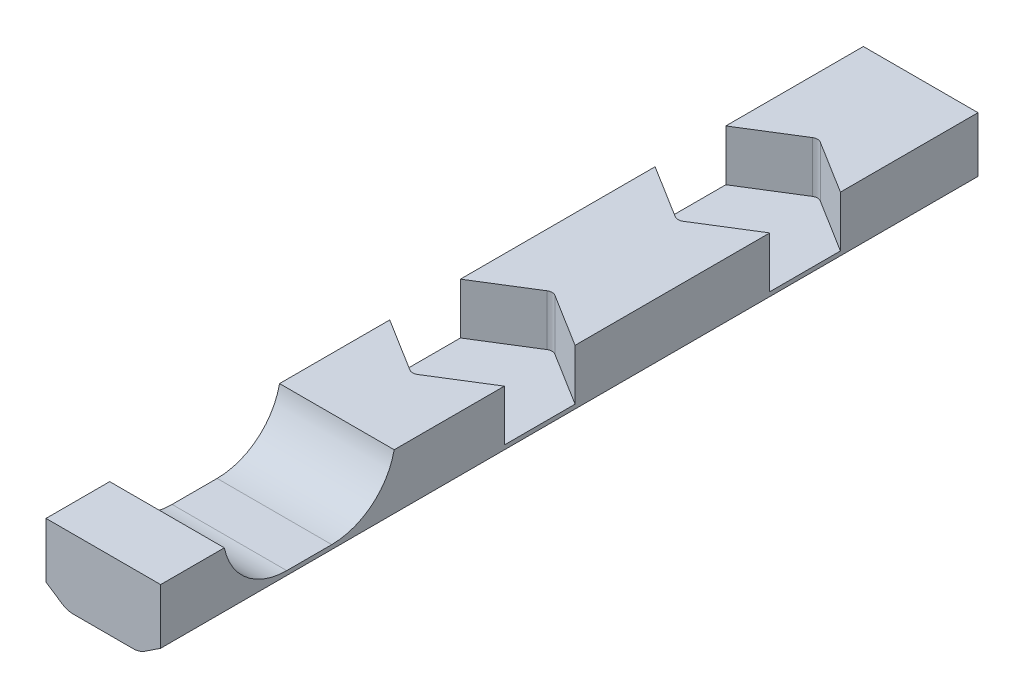
ISO-10303-21;
HEADER;
FILE_DESCRIPTION(('STEP AP214'),'2;1');
FILE_NAME('part.step','',(''),(''),'','','');
FILE_SCHEMA(('AUTOMOTIVE_DESIGN { 1 0 10303 214 1 1 1 1 }'));
ENDSEC;
DATA;
#1=APPLICATION_CONTEXT('core data for automotive mechanical design processes');
#2=APPLICATION_PROTOCOL_DEFINITION('international standard','automotive_design',2000,#1);
#3=PRODUCT_CONTEXT('',#1,'mechanical');
#4=PRODUCT('Part','Part','',(#3));
#5=PRODUCT_RELATED_PRODUCT_CATEGORY('part','',(#4));
#6=PRODUCT_DEFINITION_FORMATION('','',#4);
#7=PRODUCT_DEFINITION_CONTEXT('part definition',#1,'design');
#8=PRODUCT_DEFINITION('design','',#6,#7);
#9=PRODUCT_DEFINITION_SHAPE('','',#8);
#10=(LENGTH_UNIT() NAMED_UNIT(*) SI_UNIT(.MILLI.,.METRE.));
#11=(NAMED_UNIT(*) PLANE_ANGLE_UNIT() SI_UNIT($,.RADIAN.));
#12=(NAMED_UNIT(*) SI_UNIT($,.STERADIAN.) SOLID_ANGLE_UNIT());
#13=UNCERTAINTY_MEASURE_WITH_UNIT(LENGTH_MEASURE(1.E-05),#10,'distance_accuracy_value','');
#14=(GEOMETRIC_REPRESENTATION_CONTEXT(3) GLOBAL_UNCERTAINTY_ASSIGNED_CONTEXT((#13)) GLOBAL_UNIT_ASSIGNED_CONTEXT((#10,
#11,#12)) REPRESENTATION_CONTEXT('',''));
#15=CARTESIAN_POINT('',(0.,0.,0.));
#16=DIRECTION('',(0.,0.,1.));
#17=DIRECTION('',(1.,0.,0.));
#18=AXIS2_PLACEMENT_3D('',#15,#16,#17);
#19=CARTESIAN_POINT('',(4.4,3.26332495807108,38.5));
#20=DIRECTION('',(0.,-1.,0.));
#21=DIRECTION('',(1.,0.,0.));
#22=AXIS2_PLACEMENT_3D('',#19,#20,#21);
#23=PLANE('',#22);
#24=DIRECTION('',(0.,0.,-1.));
#25=VECTOR('',#24,1.);
#26=CARTESIAN_POINT('',(-1.,3.26332495807108,38.5));
#27=LINE('',#26,#25);
#28=CARTESIAN_POINT('',(-1.,3.26332495807108,27.5));
#29=VERTEX_POINT('',#28);
#30=CARTESIAN_POINT('',(-1.,3.26332495807108,22.31));
#31=VERTEX_POINT('',#30);
#32=EDGE_CURVE('E238',#29,#31,#27,.T.);
#33=ORIENTED_EDGE('',*,*,#32,.F.);
#34=DIRECTION('',(-1.,0.,0.));
#35=VECTOR('',#34,1.);
#36=CARTESIAN_POINT('',(-1.,3.26332495807108,27.5));
#37=LINE('',#36,#35);
#38=CARTESIAN_POINT('',(4.4,3.26332495807108,27.5));
#39=VERTEX_POINT('',#38);
#40=EDGE_CURVE('E228',#39,#29,#37,.T.);
#41=ORIENTED_EDGE('',*,*,#40,.F.);
#42=DIRECTION('',(0.,0.,-1.));
#43=VECTOR('',#42,1.);
#44=CARTESIAN_POINT('',(4.4,3.26332495807108,38.5));
#45=LINE('',#44,#43);
#46=CARTESIAN_POINT('',(4.4,3.26332495807108,22.31));
#47=VERTEX_POINT('',#46);
#48=EDGE_CURVE('E370',#39,#47,#45,.T.);
#49=ORIENTED_EDGE('',*,*,#48,.T.);
#50=DIRECTION('',(0.849056603773585,0.,-0.528301886792453));
#51=VECTOR('',#50,1.);
#52=CARTESIAN_POINT('',(1.7,3.26332495807108,23.99));
#53=LINE('',#52,#51);
#54=CARTESIAN_POINT('',(1.88490566037736,3.26332495807108,23.8749475890985));
#55=VERTEX_POINT('',#54);
#56=EDGE_CURVE('E412',#55,#47,#53,.T.);
#57=ORIENTED_EDGE('',*,*,#56,.F.);
#58=CARTESIAN_POINT('',(1.7,3.26332495807108,23.5777777777778));
#59=DIRECTION('',(0.,-1.,0.));
#60=DIRECTION('',(1.,0.,0.));
#61=AXIS2_PLACEMENT_3D('',#58,#59,#60);
#62=CIRCLE('',#61,0.35);
#63=CARTESIAN_POINT('',(1.51509433962264,3.26332495807108,23.8749475890985));
#64=VERTEX_POINT('',#63);
#65=EDGE_CURVE('E280',#55,#64,#62,.T.);
#66=ORIENTED_EDGE('',*,*,#65,.T.);
#67=DIRECTION('',(0.849056603773585,0.,0.528301886792453));
#68=VECTOR('',#67,1.);
#69=CARTESIAN_POINT('',(-1.,3.26332495807108,22.31));
#70=LINE('',#69,#68);
#71=EDGE_CURVE('E422',#31,#64,#70,.T.);
#72=ORIENTED_EDGE('',*,*,#71,.F.);
#73=EDGE_LOOP('',(#33,#41,#49,#57,#66,#72));
#74=FACE_BOUND('',#73,.T.);
#75=ADVANCED_FACE('F33',(#74),#23,.F.);
#76=CARTESIAN_POINT('',(4.4,3.26332495807108,38.5));
#77=VERTEX_POINT('',#76);
#78=CARTESIAN_POINT('',(4.4,3.26332495807108,35.5));
#79=VERTEX_POINT('',#78);
#80=EDGE_CURVE('E225',#77,#79,#45,.T.);
#81=ORIENTED_EDGE('',*,*,#80,.T.);
#82=DIRECTION('',(1.,0.,0.));
#83=VECTOR('',#82,1.);
#84=CARTESIAN_POINT('',(-1.,3.26332495807108,35.5));
#85=LINE('',#84,#83);
#86=CARTESIAN_POINT('',(-1.,3.26332495807108,35.5));
#87=VERTEX_POINT('',#86);
#88=EDGE_CURVE('E218',#87,#79,#85,.T.);
#89=ORIENTED_EDGE('',*,*,#88,.F.);
#90=CARTESIAN_POINT('',(-1.,3.26332495807108,38.5));
#91=VERTEX_POINT('',#90);
#92=EDGE_CURVE('E222',#91,#87,#27,.T.);
#93=ORIENTED_EDGE('',*,*,#92,.F.);
#94=DIRECTION('',(-1.,0.,0.));
#95=VECTOR('',#94,1.);
#96=CARTESIAN_POINT('',(4.4,3.26332495807108,38.5));
#97=LINE('',#96,#95);
#98=EDGE_CURVE('E349',#77,#91,#97,.T.);
#99=ORIENTED_EDGE('',*,*,#98,.F.);
#100=EDGE_LOOP('',(#81,#89,#93,#99));
#101=FACE_BOUND('',#100,.T.);
#102=ADVANCED_FACE('F220',(#101),#23,.F.);
#103=CARTESIAN_POINT('',(-1.,3.26332495807108,18.98));
#104=VERTEX_POINT('',#103);
#105=CARTESIAN_POINT('',(-1.,3.26332495807108,9.81));
#106=VERTEX_POINT('',#105);
#107=EDGE_CURVE('E423',#104,#106,#27,.T.);
#108=ORIENTED_EDGE('',*,*,#107,.F.);
#109=DIRECTION('',(-0.849056603773585,0.,0.528301886792453));
#110=VECTOR('',#109,1.);
#111=CARTESIAN_POINT('',(1.7,3.26332495807108,17.3));
#112=LINE('',#111,#110);
#113=CARTESIAN_POINT('',(1.51509433962264,3.26332495807108,17.4150524109015));
#114=VERTEX_POINT('',#113);
#115=EDGE_CURVE('E732',#114,#104,#112,.T.);
#116=ORIENTED_EDGE('',*,*,#115,.F.);
#117=CARTESIAN_POINT('',(1.7,3.26332495807108,17.7122222222222));
#118=DIRECTION('',(0.,-1.,0.));
#119=DIRECTION('',(1.,0.,0.));
#120=AXIS2_PLACEMENT_3D('',#117,#118,#119);
#121=CIRCLE('',#120,0.35);
#122=CARTESIAN_POINT('',(1.88490566037735,3.26332495807108,17.4150524109015));
#123=VERTEX_POINT('',#122);
#124=EDGE_CURVE('E278',#114,#123,#121,.T.);
#125=ORIENTED_EDGE('',*,*,#124,.T.);
#126=DIRECTION('',(-0.849056603773585,0.,-0.528301886792453));
#127=VECTOR('',#126,1.);
#128=CARTESIAN_POINT('',(4.4,3.26332495807108,18.98));
#129=LINE('',#128,#127);
#130=CARTESIAN_POINT('',(4.4,3.26332495807108,18.98));
#131=VERTEX_POINT('',#130);
#132=EDGE_CURVE('E734',#131,#123,#129,.T.);
#133=ORIENTED_EDGE('',*,*,#132,.F.);
#134=CARTESIAN_POINT('',(4.4,3.26332495807108,9.81));
#135=VERTEX_POINT('',#134);
#136=EDGE_CURVE('E459',#131,#135,#45,.T.);
#137=ORIENTED_EDGE('',*,*,#136,.T.);
#138=DIRECTION('',(0.849056603773585,0.,-0.528301886792453));
#139=VECTOR('',#138,1.);
#140=CARTESIAN_POINT('',(1.7,3.26332495807108,11.49));
#141=LINE('',#140,#139);
#142=CARTESIAN_POINT('',(1.88490566037736,3.26332495807108,11.3749475890985));
#143=VERTEX_POINT('',#142);
#144=EDGE_CURVE('E298',#143,#135,#141,.T.);
#145=ORIENTED_EDGE('',*,*,#144,.F.);
#146=CARTESIAN_POINT('',(1.7,3.26332495807108,11.0777777777778));
#147=DIRECTION('',(0.,-1.,0.));
#148=DIRECTION('',(1.,0.,0.));
#149=AXIS2_PLACEMENT_3D('',#146,#147,#148);
#150=CIRCLE('',#149,0.35);
#151=CARTESIAN_POINT('',(1.51509433962264,3.26332495807108,11.3749475890985));
#152=VERTEX_POINT('',#151);
#153=EDGE_CURVE('E11',#143,#152,#150,.T.);
#154=ORIENTED_EDGE('',*,*,#153,.T.);
#155=DIRECTION('',(0.849056603773585,0.,0.528301886792453));
#156=VECTOR('',#155,1.);
#157=CARTESIAN_POINT('',(-1.,3.26332495807108,9.81));
#158=LINE('',#157,#156);
#159=EDGE_CURVE('E328',#106,#152,#158,.T.);
#160=ORIENTED_EDGE('',*,*,#159,.F.);
#161=EDGE_LOOP('',(#108,#116,#125,#133,#137,#145,#154,#160));
#162=FACE_BOUND('',#161,.T.);
#163=ADVANCED_FACE('F486',(#162),#23,.F.);
#164=CARTESIAN_POINT('',(-1.,0.663324958071079,38.5));
#165=DIRECTION('',(0.552770798392566,0.833333333333334,0.));
#166=DIRECTION('',(-0.833333333333334,0.552770798392566,0.));
#167=AXIS2_PLACEMENT_3D('',#164,#165,#166);
#168=PLANE('',#167);
#169=DIRECTION('',(0.833333333333334,-0.552770798392566,0.));
#170=VECTOR('',#169,1.);
#171=CARTESIAN_POINT('',(-1.,0.663324958071079,0.));
#172=LINE('',#171,#170);
#173=CARTESIAN_POINT('',(-1.,0.663324958071079,0.));
#174=VERTEX_POINT('',#173);
#175=CARTESIAN_POINT('',(-0.251259453814803,0.166666666666667,0.));
#176=VERTEX_POINT('',#175);
#177=EDGE_CURVE('E334',#174,#176,#172,.T.);
#178=ORIENTED_EDGE('',*,*,#177,.T.);
#179=DIRECTION('',(0.,0.,-1.));
#180=VECTOR('',#179,1.);
#181=CARTESIAN_POINT('',(-0.251259453814803,0.166666666666667,38.5));
#182=LINE('',#181,#180);
#183=CARTESIAN_POINT('',(-0.251259453814803,0.166666666666667,38.5));
#184=VERTEX_POINT('',#183);
#185=EDGE_CURVE('E389',#176,#184,#182,.F.);
#186=ORIENTED_EDGE('',*,*,#185,.T.);
#187=DIRECTION('',(0.833333333333334,-0.552770798392566,0.));
#188=VECTOR('',#187,1.);
#189=CARTESIAN_POINT('',(-1.,0.663324958071079,38.5));
#190=LINE('',#189,#188);
#191=CARTESIAN_POINT('',(-1.,0.663324958071079,38.5));
#192=VERTEX_POINT('',#191);
#193=EDGE_CURVE('E339',#192,#184,#190,.T.);
#194=ORIENTED_EDGE('',*,*,#193,.F.);
#195=DIRECTION('',(0.,0.,-1.));
#196=VECTOR('',#195,1.);
#197=CARTESIAN_POINT('',(-1.,0.663324958071079,38.5));
#198=LINE('',#197,#196);
#199=EDGE_CURVE('E352',#192,#174,#198,.T.);
#200=ORIENTED_EDGE('',*,*,#199,.T.);
#201=EDGE_LOOP('',(#178,#186,#194,#200));
#202=FACE_BOUND('',#201,.T.);
#203=ADVANCED_FACE('F436',(#202),#168,.F.);
#204=CARTESIAN_POINT('',(0.,0.,38.5));
#205=DIRECTION('',(0.,1.,0.));
#206=DIRECTION('',(0.,0.,1.));
#207=AXIS2_PLACEMENT_3D('',#204,#205,#206);
#208=PLANE('',#207);
#209=DIRECTION('',(1.,0.,0.));
#210=VECTOR('',#209,1.);
#211=CARTESIAN_POINT('',(0.,0.,38.5));
#212=LINE('',#211,#210);
#213=CARTESIAN_POINT('',(0.301511344577763,0.,38.5));
#214=VERTEX_POINT('',#213);
#215=CARTESIAN_POINT('',(3.09848865542224,0.,38.5));
#216=VERTEX_POINT('',#215);
#217=EDGE_CURVE('E342',#214,#216,#212,.T.);
#218=ORIENTED_EDGE('',*,*,#217,.F.);
#219=DIRECTION('',(0.,0.,-1.));
#220=VECTOR('',#219,1.);
#221=CARTESIAN_POINT('',(0.301511344577763,0.,38.5));
#222=LINE('',#221,#220);
#223=CARTESIAN_POINT('',(0.301511344577763,0.,0.));
#224=VERTEX_POINT('',#223);
#225=EDGE_CURVE('E384',#214,#224,#222,.T.);
#226=ORIENTED_EDGE('',*,*,#225,.T.);
#227=DIRECTION('',(1.,0.,0.));
#228=VECTOR('',#227,1.);
#229=CARTESIAN_POINT('',(0.,0.,0.));
#230=LINE('',#229,#228);
#231=CARTESIAN_POINT('',(3.09848865542224,0.,0.));
#232=VERTEX_POINT('',#231);
#233=EDGE_CURVE('E355',#224,#232,#230,.T.);
#234=ORIENTED_EDGE('',*,*,#233,.T.);
#235=DIRECTION('',(0.,0.,-1.));
#236=VECTOR('',#235,1.);
#237=CARTESIAN_POINT('',(3.09848865542224,0.,38.5));
#238=LINE('',#237,#236);
#239=EDGE_CURVE('E379',#232,#216,#238,.F.);
#240=ORIENTED_EDGE('',*,*,#239,.T.);
#241=EDGE_LOOP('',(#218,#226,#234,#240));
#242=FACE_BOUND('',#241,.T.);
#243=ADVANCED_FACE('F446',(#242),#208,.F.);
#244=CARTESIAN_POINT('',(3.4,0.,38.5));
#245=DIRECTION('',(-0.552770798392566,0.833333333333333,0.));
#246=DIRECTION('',(-0.833333333333333,-0.552770798392566,0.));
#247=AXIS2_PLACEMENT_3D('',#244,#245,#246);
#248=PLANE('',#247);
#249=DIRECTION('',(0.833333333333333,0.552770798392566,0.));
#250=VECTOR('',#249,1.);
#251=CARTESIAN_POINT('',(3.4,0.,38.5));
#252=LINE('',#251,#250);
#253=CARTESIAN_POINT('',(3.6512594538148,0.166666666666666,38.5));
#254=VERTEX_POINT('',#253);
#255=CARTESIAN_POINT('',(4.4,0.66332495807108,38.5));
#256=VERTEX_POINT('',#255);
#257=EDGE_CURVE('E345',#254,#256,#252,.T.);
#258=ORIENTED_EDGE('',*,*,#257,.F.);
#259=DIRECTION('',(0.,0.,-1.));
#260=VECTOR('',#259,1.);
#261=CARTESIAN_POINT('',(3.6512594538148,0.166666666666666,38.5));
#262=LINE('',#261,#260);
#263=CARTESIAN_POINT('',(3.6512594538148,0.166666666666666,0.));
#264=VERTEX_POINT('',#263);
#265=EDGE_CURVE('E373',#254,#264,#262,.T.);
#266=ORIENTED_EDGE('',*,*,#265,.T.);
#267=DIRECTION('',(0.833333333333333,0.552770798392566,0.));
#268=VECTOR('',#267,1.);
#269=CARTESIAN_POINT('',(3.4,0.,0.));
#270=LINE('',#269,#268);
#271=CARTESIAN_POINT('',(4.4,0.66332495807108,0.));
#272=VERTEX_POINT('',#271);
#273=EDGE_CURVE('E357',#264,#272,#270,.T.);
#274=ORIENTED_EDGE('',*,*,#273,.T.);
#275=DIRECTION('',(0.,0.,-1.));
#276=VECTOR('',#275,1.);
#277=CARTESIAN_POINT('',(4.4,0.66332495807108,38.5));
#278=LINE('',#277,#276);
#279=EDGE_CURVE('E369',#256,#272,#278,.T.);
#280=ORIENTED_EDGE('',*,*,#279,.F.);
#281=EDGE_LOOP('',(#258,#266,#274,#280));
#282=FACE_BOUND('',#281,.T.);
#283=ADVANCED_FACE('F455',(#282),#248,.F.);
#284=CARTESIAN_POINT('',(4.4,0.66332495807108,38.5));
#285=DIRECTION('',(-1.,0.,0.));
#286=DIRECTION('',(0.,0.,1.));
#287=AXIS2_PLACEMENT_3D('',#284,#285,#286);
#288=PLANE('',#287);
#289=ORIENTED_EDGE('',*,*,#48,.F.);
#290=CARTESIAN_POINT('',(4.4,3.86332495807108,30.4393876913398));
#291=DIRECTION('',(-1.,0.,0.));
#292=DIRECTION('',(0.,0.,1.));
#293=AXIS2_PLACEMENT_3D('',#290,#291,#292);
#294=CIRCLE('',#293,3.);
#295=CARTESIAN_POINT('',(4.4,0.86332495807108,30.4393876913398));
#296=VERTEX_POINT('',#295);
#297=EDGE_CURVE('E251',#39,#296,#294,.T.);
#298=ORIENTED_EDGE('',*,*,#297,.T.);
#299=DIRECTION('',(0.,0.,-1.));
#300=VECTOR('',#299,1.);
#301=CARTESIAN_POINT('',(4.4,0.86332495807108,35.5));
#302=LINE('',#301,#300);
#303=CARTESIAN_POINT('',(4.4,0.86332495807108,32.5606123086602));
#304=VERTEX_POINT('',#303);
#305=EDGE_CURVE('E404',#304,#296,#302,.T.);
#306=ORIENTED_EDGE('',*,*,#305,.F.);
#307=CARTESIAN_POINT('',(4.4,3.86332495807108,32.5606123086602));
#308=DIRECTION('',(-1.,0.,0.));
#309=DIRECTION('',(0.,0.,1.));
#310=AXIS2_PLACEMENT_3D('',#307,#308,#309);
#311=CIRCLE('',#310,3.);
#312=EDGE_CURVE('E246',#304,#79,#311,.T.);
#313=ORIENTED_EDGE('',*,*,#312,.T.);
#314=ORIENTED_EDGE('',*,*,#80,.F.);
#315=DIRECTION('',(0.,1.,0.));
#316=VECTOR('',#315,1.);
#317=CARTESIAN_POINT('',(4.4,0.66332495807108,38.5));
#318=LINE('',#317,#316);
#319=EDGE_CURVE('E347',#256,#77,#318,.T.);
#320=ORIENTED_EDGE('',*,*,#319,.F.);
#321=ORIENTED_EDGE('',*,*,#279,.T.);
#322=DIRECTION('',(0.,1.,0.));
#323=VECTOR('',#322,1.);
#324=CARTESIAN_POINT('',(4.4,0.66332495807108,0.));
#325=LINE('',#324,#323);
#326=CARTESIAN_POINT('',(4.4,3.26332495807108,0.));
#327=VERTEX_POINT('',#326);
#328=EDGE_CURVE('E359',#272,#327,#325,.T.);
#329=ORIENTED_EDGE('',*,*,#328,.T.);
#330=CARTESIAN_POINT('',(4.4,3.26332495807108,6.48));
#331=VERTEX_POINT('',#330);
#332=EDGE_CURVE('E237',#331,#327,#45,.T.);
#333=ORIENTED_EDGE('',*,*,#332,.F.);
#334=DIRECTION('',(0.,1.,0.));
#335=VECTOR('',#334,1.);
#336=CARTESIAN_POINT('',(4.4,0.86332495807108,6.48));
#337=LINE('',#336,#335);
#338=CARTESIAN_POINT('',(4.4,0.86332495807108,6.48));
#339=VERTEX_POINT('',#338);
#340=EDGE_CURVE('E297',#339,#331,#337,.T.);
#341=ORIENTED_EDGE('',*,*,#340,.F.);
#342=DIRECTION('',(0.,0.,-1.));
#343=VECTOR('',#342,1.);
#344=CARTESIAN_POINT('',(4.4,0.86332495807108,9.81));
#345=LINE('',#344,#343);
#346=CARTESIAN_POINT('',(4.4,0.86332495807108,9.81));
#347=VERTEX_POINT('',#346);
#348=EDGE_CURVE('E318',#347,#339,#345,.T.);
#349=ORIENTED_EDGE('',*,*,#348,.F.);
#350=DIRECTION('',(0.,1.,0.));
#351=VECTOR('',#350,1.);
#352=CARTESIAN_POINT('',(4.4,0.86332495807108,9.81));
#353=LINE('',#352,#351);
#354=EDGE_CURVE('E324',#347,#135,#353,.T.);
#355=ORIENTED_EDGE('',*,*,#354,.T.);
#356=ORIENTED_EDGE('',*,*,#136,.F.);
#357=DIRECTION('',(0.,1.,0.));
#358=VECTOR('',#357,1.);
#359=CARTESIAN_POINT('',(4.4,0.86332495807108,18.98));
#360=LINE('',#359,#358);
#361=CARTESIAN_POINT('',(4.4,0.86332495807108,18.98));
#362=VERTEX_POINT('',#361);
#363=EDGE_CURVE('E472',#362,#131,#360,.T.);
#364=ORIENTED_EDGE('',*,*,#363,.F.);
#365=DIRECTION('',(0.,0.,-1.));
#366=VECTOR('',#365,1.);
#367=CARTESIAN_POINT('',(4.4,0.86332495807108,22.31));
#368=LINE('',#367,#366);
#369=CARTESIAN_POINT('',(4.4,0.86332495807108,22.31));
#370=VERTEX_POINT('',#369);
#371=EDGE_CURVE('E469',#370,#362,#368,.T.);
#372=ORIENTED_EDGE('',*,*,#371,.F.);
#373=DIRECTION('',(0.,1.,0.));
#374=VECTOR('',#373,1.);
#375=CARTESIAN_POINT('',(4.4,0.86332495807108,22.31));
#376=LINE('',#375,#374);
#377=EDGE_CURVE('E466',#370,#47,#376,.T.);
#378=ORIENTED_EDGE('',*,*,#377,.T.);
#379=EDGE_LOOP('',(#289,#298,#306,#313,#314,#320,#321,#329,#333,#341,#349,#355,#356,#364,#372,#378));
#380=FACE_BOUND('',#379,.T.);
#381=ADVANCED_FACE('F403',(#380),#288,.F.);
#382=CARTESIAN_POINT('',(-1.,3.26332495807108,6.48));
#383=VERTEX_POINT('',#382);
#384=CARTESIAN_POINT('',(-1.,3.26332495807108,0.));
#385=VERTEX_POINT('',#384);
#386=EDGE_CURVE('E240',#383,#385,#27,.T.);
#387=ORIENTED_EDGE('',*,*,#386,.F.);
#388=DIRECTION('',(-0.849056603773585,0.,0.528301886792453));
#389=VECTOR('',#388,1.);
#390=CARTESIAN_POINT('',(1.7,3.26332495807108,4.8));
#391=LINE('',#390,#389);
#392=CARTESIAN_POINT('',(1.51509433962264,3.26332495807108,4.91505241090147));
#393=VERTEX_POINT('',#392);
#394=EDGE_CURVE('E289',#393,#383,#391,.T.);
#395=ORIENTED_EDGE('',*,*,#394,.F.);
#396=CARTESIAN_POINT('',(1.7,3.26332495807108,5.21222222222222));
#397=DIRECTION('',(0.,-1.,0.));
#398=DIRECTION('',(1.,0.,0.));
#399=AXIS2_PLACEMENT_3D('',#396,#397,#398);
#400=CIRCLE('',#399,0.35);
#401=CARTESIAN_POINT('',(1.88490566037736,3.26332495807108,4.91505241090147));
#402=VERTEX_POINT('',#401);
#403=EDGE_CURVE('E41',#393,#402,#400,.T.);
#404=ORIENTED_EDGE('',*,*,#403,.T.);
#405=DIRECTION('',(-0.849056603773585,0.,-0.528301886792453));
#406=VECTOR('',#405,1.);
#407=CARTESIAN_POINT('',(4.4,3.26332495807108,6.48));
#408=LINE('',#407,#406);
#409=EDGE_CURVE('E287',#331,#402,#408,.T.);
#410=ORIENTED_EDGE('',*,*,#409,.F.);
#411=ORIENTED_EDGE('',*,*,#332,.T.);
#412=DIRECTION('',(-1.,0.,0.));
#413=VECTOR('',#412,1.);
#414=CARTESIAN_POINT('',(4.4,3.26332495807108,0.));
#415=LINE('',#414,#413);
#416=EDGE_CURVE('E362',#327,#385,#415,.T.);
#417=ORIENTED_EDGE('',*,*,#416,.T.);
#418=EDGE_LOOP('',(#387,#395,#404,#410,#411,#417));
#419=FACE_BOUND('',#418,.T.);
#420=ADVANCED_FACE('F286',(#419),#23,.F.);
#421=CARTESIAN_POINT('',(-1.,3.26332495807108,38.5));
#422=DIRECTION('',(1.,0.,0.));
#423=DIRECTION('',(0.,1.,0.));
#424=AXIS2_PLACEMENT_3D('',#421,#422,#423);
#425=PLANE('',#424);
#426=DIRECTION('',(0.,0.,1.));
#427=VECTOR('',#426,1.);
#428=CARTESIAN_POINT('',(-1.,0.863324958071079,35.5));
#429=LINE('',#428,#427);
#430=CARTESIAN_POINT('',(-1.,0.863324958071079,30.4393876913398));
#431=VERTEX_POINT('',#430);
#432=CARTESIAN_POINT('',(-1.,0.863324958071079,32.5606123086602));
#433=VERTEX_POINT('',#432);
#434=EDGE_CURVE('E413',#431,#433,#429,.T.);
#435=ORIENTED_EDGE('',*,*,#434,.F.);
#436=CARTESIAN_POINT('',(-1.,3.86332495807108,30.4393876913398));
#437=DIRECTION('',(1.,0.,0.));
#438=DIRECTION('',(0.,1.,0.));
#439=AXIS2_PLACEMENT_3D('',#436,#437,#438);
#440=CIRCLE('',#439,3.);
#441=EDGE_CURVE('E397',#431,#29,#440,.T.);
#442=ORIENTED_EDGE('',*,*,#441,.T.);
#443=ORIENTED_EDGE('',*,*,#32,.T.);
#444=DIRECTION('',(0.,1.,0.));
#445=VECTOR('',#444,1.);
#446=CARTESIAN_POINT('',(-1.,0.863324958071079,22.31));
#447=LINE('',#446,#445);
#448=CARTESIAN_POINT('',(-1.,0.863324958071079,22.31));
#449=VERTEX_POINT('',#448);
#450=EDGE_CURVE('E325',#449,#31,#447,.T.);
#451=ORIENTED_EDGE('',*,*,#450,.F.);
#452=DIRECTION('',(0.,0.,1.));
#453=VECTOR('',#452,1.);
#454=CARTESIAN_POINT('',(-1.,0.863324958071079,18.98));
#455=LINE('',#454,#453);
#456=CARTESIAN_POINT('',(-1.,0.863324958071078,18.98));
#457=VERTEX_POINT('',#456);
#458=EDGE_CURVE('E478',#457,#449,#455,.T.);
#459=ORIENTED_EDGE('',*,*,#458,.F.);
#460=DIRECTION('',(0.,1.,0.));
#461=VECTOR('',#460,1.);
#462=CARTESIAN_POINT('',(-1.,0.863324958071079,18.98));
#463=LINE('',#462,#461);
#464=EDGE_CURVE('E475',#457,#104,#463,.T.);
#465=ORIENTED_EDGE('',*,*,#464,.T.);
#466=ORIENTED_EDGE('',*,*,#107,.T.);
#467=DIRECTION('',(0.,1.,0.));
#468=VECTOR('',#467,1.);
#469=CARTESIAN_POINT('',(-0.999999999999999,0.863324958071079,9.81));
#470=LINE('',#469,#468);
#471=CARTESIAN_POINT('',(-0.999999999999999,0.863324958071079,9.81));
#472=VERTEX_POINT('',#471);
#473=EDGE_CURVE('E331',#472,#106,#470,.T.);
#474=ORIENTED_EDGE('',*,*,#473,.F.);
#475=DIRECTION('',(0.,0.,1.));
#476=VECTOR('',#475,1.);
#477=CARTESIAN_POINT('',(-1.,0.863324958071079,6.48));
#478=LINE('',#477,#476);
#479=CARTESIAN_POINT('',(-1.,0.863324958071078,6.48));
#480=VERTEX_POINT('',#479);
#481=EDGE_CURVE('E314',#480,#472,#478,.T.);
#482=ORIENTED_EDGE('',*,*,#481,.F.);
#483=DIRECTION('',(0.,1.,0.));
#484=VECTOR('',#483,1.);
#485=CARTESIAN_POINT('',(-1.,0.863324958071079,6.48));
#486=LINE('',#485,#484);
#487=EDGE_CURVE('E312',#480,#383,#486,.T.);
#488=ORIENTED_EDGE('',*,*,#487,.T.);
#489=ORIENTED_EDGE('',*,*,#386,.T.);
#490=DIRECTION('',(0.,-1.,0.));
#491=VECTOR('',#490,1.);
#492=CARTESIAN_POINT('',(-1.,3.26332495807108,0.));
#493=LINE('',#492,#491);
#494=EDGE_CURVE('E343',#385,#174,#493,.T.);
#495=ORIENTED_EDGE('',*,*,#494,.T.);
#496=ORIENTED_EDGE('',*,*,#199,.F.);
#497=DIRECTION('',(0.,-1.,0.));
#498=VECTOR('',#497,1.);
#499=CARTESIAN_POINT('',(-1.,3.26332495807108,38.5));
#500=LINE('',#499,#498);
#501=EDGE_CURVE('E236',#91,#192,#500,.T.);
#502=ORIENTED_EDGE('',*,*,#501,.F.);
#503=ORIENTED_EDGE('',*,*,#92,.T.);
#504=CARTESIAN_POINT('',(-1.,3.86332495807108,32.5606123086602));
#505=DIRECTION('',(1.,0.,0.));
#506=DIRECTION('',(0.,1.,0.));
#507=AXIS2_PLACEMENT_3D('',#504,#505,#506);
#508=CIRCLE('',#507,3.);
#509=EDGE_CURVE('E233',#87,#433,#508,.T.);
#510=ORIENTED_EDGE('',*,*,#509,.T.);
#511=EDGE_LOOP('',(#435,#442,#443,#451,#459,#465,#466,#474,#482,#488,#489,#495,#496,#502,#503,#510));
#512=FACE_BOUND('',#511,.T.);
#513=ADVANCED_FACE('F232',(#512),#425,.F.);
#514=CARTESIAN_POINT('',(0.,0.,38.5));
#515=DIRECTION('',(0.,0.,1.));
#516=DIRECTION('',(1.,0.,0.));
#517=AXIS2_PLACEMENT_3D('',#514,#515,#516);
#518=PLANE('',#517);
#519=ORIENTED_EDGE('',*,*,#193,.T.);
#520=CARTESIAN_POINT('',(0.301511344577763,1.,38.5));
#521=DIRECTION('',(0.,0.,1.));
#522=DIRECTION('',(1.,0.,0.));
#523=AXIS2_PLACEMENT_3D('',#520,#521,#522);
#524=CIRCLE('',#523,1.);
#525=EDGE_CURVE('E391',#184,#214,#524,.T.);
#526=ORIENTED_EDGE('',*,*,#525,.T.);
#527=ORIENTED_EDGE('',*,*,#217,.T.);
#528=CARTESIAN_POINT('',(3.09848865542224,1.,38.5));
#529=DIRECTION('',(0.,0.,1.));
#530=DIRECTION('',(1.,0.,0.));
#531=AXIS2_PLACEMENT_3D('',#528,#529,#530);
#532=CIRCLE('',#531,1.);
#533=EDGE_CURVE('E382',#216,#254,#532,.T.);
#534=ORIENTED_EDGE('',*,*,#533,.T.);
#535=ORIENTED_EDGE('',*,*,#257,.T.);
#536=ORIENTED_EDGE('',*,*,#319,.T.);
#537=ORIENTED_EDGE('',*,*,#98,.T.);
#538=ORIENTED_EDGE('',*,*,#501,.T.);
#539=EDGE_LOOP('',(#519,#526,#527,#534,#535,#536,#537,#538));
#540=FACE_BOUND('',#539,.T.);
#541=ADVANCED_FACE('F444',(#540),#518,.T.);
#542=CARTESIAN_POINT('',(0.,0.,0.));
#543=DIRECTION('',(0.,0.,1.));
#544=DIRECTION('',(1.,0.,0.));
#545=AXIS2_PLACEMENT_3D('',#542,#543,#544);
#546=PLANE('',#545);
#547=ORIENTED_EDGE('',*,*,#233,.F.);
#548=CARTESIAN_POINT('',(0.301511344577763,1.,0.));
#549=DIRECTION('',(0.,0.,1.));
#550=DIRECTION('',(1.,0.,0.));
#551=AXIS2_PLACEMENT_3D('',#548,#549,#550);
#552=CIRCLE('',#551,1.);
#553=EDGE_CURVE('E387',#224,#176,#552,.F.);
#554=ORIENTED_EDGE('',*,*,#553,.T.);
#555=ORIENTED_EDGE('',*,*,#177,.F.);
#556=ORIENTED_EDGE('',*,*,#494,.F.);
#557=ORIENTED_EDGE('',*,*,#416,.F.);
#558=ORIENTED_EDGE('',*,*,#328,.F.);
#559=ORIENTED_EDGE('',*,*,#273,.F.);
#560=CARTESIAN_POINT('',(3.09848865542224,1.,0.));
#561=DIRECTION('',(0.,0.,1.));
#562=DIRECTION('',(1.,0.,0.));
#563=AXIS2_PLACEMENT_3D('',#560,#561,#562);
#564=CIRCLE('',#563,1.);
#565=EDGE_CURVE('E376',#264,#232,#564,.F.);
#566=ORIENTED_EDGE('',*,*,#565,.T.);
#567=EDGE_LOOP('',(#547,#554,#555,#556,#557,#558,#559,#566));
#568=FACE_BOUND('',#567,.T.);
#569=ADVANCED_FACE('F433',(#568),#546,.F.);
#570=CARTESIAN_POINT('',(3.09848865542224,1.,38.5));
#571=DIRECTION('',(0.,0.,-1.));
#572=DIRECTION('',(-1.,0.,0.));
#573=AXIS2_PLACEMENT_3D('',#570,#571,#572);
#574=CYLINDRICAL_SURFACE('',#573,1.);
#575=ORIENTED_EDGE('',*,*,#533,.F.);
#576=ORIENTED_EDGE('',*,*,#239,.F.);
#577=ORIENTED_EDGE('',*,*,#565,.F.);
#578=ORIENTED_EDGE('',*,*,#265,.F.);
#579=EDGE_LOOP('',(#575,#576,#577,#578));
#580=FACE_BOUND('',#579,.T.);
#581=ADVANCED_FACE('F451',(#580),#574,.T.);
#582=CARTESIAN_POINT('',(0.301511344577763,1.,38.5));
#583=DIRECTION('',(0.,0.,-1.));
#584=DIRECTION('',(-1.,0.,0.));
#585=AXIS2_PLACEMENT_3D('',#582,#583,#584);
#586=CYLINDRICAL_SURFACE('',#585,1.);
#587=ORIENTED_EDGE('',*,*,#525,.F.);
#588=ORIENTED_EDGE('',*,*,#185,.F.);
#589=ORIENTED_EDGE('',*,*,#553,.F.);
#590=ORIENTED_EDGE('',*,*,#225,.F.);
#591=EDGE_LOOP('',(#587,#588,#589,#590));
#592=FACE_BOUND('',#591,.T.);
#593=ADVANCED_FACE('F440',(#592),#586,.T.);
#594=CARTESIAN_POINT('',(1.7,0.863324958071079,11.49));
#595=DIRECTION('',(0.528301886792453,0.,0.849056603773585));
#596=DIRECTION('',(0.849056603773585,0.,-0.528301886792453));
#597=AXIS2_PLACEMENT_3D('',#594,#595,#596);
#598=PLANE('',#597);
#599=DIRECTION('',(0.849056603773585,0.,-0.528301886792453));
#600=VECTOR('',#599,1.);
#601=CARTESIAN_POINT('',(1.7,0.863324958071079,11.49));
#602=LINE('',#601,#600);
#603=CARTESIAN_POINT('',(1.88490566037736,0.863324958071079,11.3749475890985));
#604=VERTEX_POINT('',#603);
#605=EDGE_CURVE('E330',#604,#347,#602,.T.);
#606=ORIENTED_EDGE('',*,*,#605,.F.);
#607=DIRECTION('',(0.,1.,0.));
#608=VECTOR('',#607,1.);
#609=CARTESIAN_POINT('',(1.88490566037736,3.26332495807108,11.3749475890985));
#610=LINE('',#609,#608);
#611=EDGE_CURVE('E274',#604,#143,#610,.T.);
#612=ORIENTED_EDGE('',*,*,#611,.T.);
#613=ORIENTED_EDGE('',*,*,#144,.T.);
#614=ORIENTED_EDGE('',*,*,#354,.F.);
#615=EDGE_LOOP('',(#606,#612,#613,#614));
#616=FACE_BOUND('',#615,.T.);
#617=ADVANCED_FACE('F485',(#616),#598,.F.);
#618=CARTESIAN_POINT('',(-0.999999999999999,0.863324958071079,9.81));
#619=DIRECTION('',(-0.528301886792453,0.,0.849056603773585));
#620=DIRECTION('',(0.849056603773585,0.,0.528301886792453));
#621=AXIS2_PLACEMENT_3D('',#618,#619,#620);
#622=PLANE('',#621);
#623=ORIENTED_EDGE('',*,*,#159,.T.);
#624=DIRECTION('',(0.,1.,0.));
#625=VECTOR('',#624,1.);
#626=CARTESIAN_POINT('',(1.51509433962264,0.863324958071079,11.3749475890985));
#627=LINE('',#626,#625);
#628=CARTESIAN_POINT('',(1.51509433962264,0.863324958071079,11.3749475890985));
#629=VERTEX_POINT('',#628);
#630=EDGE_CURVE('E276',#152,#629,#627,.F.);
#631=ORIENTED_EDGE('',*,*,#630,.T.);
#632=DIRECTION('',(0.849056603773585,0.,0.528301886792453));
#633=VECTOR('',#632,1.);
#634=CARTESIAN_POINT('',(-0.999999999999999,0.863324958071079,9.81));
#635=LINE('',#634,#633);
#636=EDGE_CURVE('E316',#472,#629,#635,.T.);
#637=ORIENTED_EDGE('',*,*,#636,.F.);
#638=ORIENTED_EDGE('',*,*,#473,.T.);
#639=EDGE_LOOP('',(#623,#631,#637,#638));
#640=FACE_BOUND('',#639,.T.);
#641=ADVANCED_FACE('F599',(#640),#622,.F.);
#642=CARTESIAN_POINT('',(1.7,0.863324958071079,4.8));
#643=DIRECTION('',(-0.528301886792453,0.,-0.849056603773585));
#644=DIRECTION('',(-0.849056603773585,0.,0.528301886792453));
#645=AXIS2_PLACEMENT_3D('',#642,#643,#644);
#646=PLANE('',#645);
#647=DIRECTION('',(-0.849056603773585,0.,0.528301886792453));
#648=VECTOR('',#647,1.);
#649=CARTESIAN_POINT('',(1.7,0.863324958071079,4.8));
#650=LINE('',#649,#648);
#651=CARTESIAN_POINT('',(1.51509433962264,0.863324958071079,4.91505241090147));
#652=VERTEX_POINT('',#651);
#653=EDGE_CURVE('E305',#652,#480,#650,.T.);
#654=ORIENTED_EDGE('',*,*,#653,.F.);
#655=DIRECTION('',(0.,1.,0.));
#656=VECTOR('',#655,1.);
#657=CARTESIAN_POINT('',(1.51509433962264,3.26332495807108,4.91505241090147));
#658=LINE('',#657,#656);
#659=EDGE_CURVE('E265',#652,#393,#658,.T.);
#660=ORIENTED_EDGE('',*,*,#659,.T.);
#661=ORIENTED_EDGE('',*,*,#394,.T.);
#662=ORIENTED_EDGE('',*,*,#487,.F.);
#663=EDGE_LOOP('',(#654,#660,#661,#662));
#664=FACE_BOUND('',#663,.T.);
#665=ADVANCED_FACE('F310',(#664),#646,.F.);
#666=CARTESIAN_POINT('',(4.4,0.86332495807108,6.48));
#667=DIRECTION('',(0.528301886792453,0.,-0.849056603773585));
#668=DIRECTION('',(-0.849056603773585,0.,-0.528301886792453));
#669=AXIS2_PLACEMENT_3D('',#666,#667,#668);
#670=PLANE('',#669);
#671=ORIENTED_EDGE('',*,*,#409,.T.);
#672=DIRECTION('',(0.,1.,0.));
#673=VECTOR('',#672,1.);
#674=CARTESIAN_POINT('',(1.88490566037736,0.863324958071079,4.91505241090147));
#675=LINE('',#674,#673);
#676=CARTESIAN_POINT('',(1.88490566037736,0.863324958071079,4.91505241090147));
#677=VERTEX_POINT('',#676);
#678=EDGE_CURVE('E268',#402,#677,#675,.F.);
#679=ORIENTED_EDGE('',*,*,#678,.T.);
#680=DIRECTION('',(-0.849056603773585,0.,-0.528301886792453));
#681=VECTOR('',#680,1.);
#682=CARTESIAN_POINT('',(4.4,0.86332495807108,6.48));
#683=LINE('',#682,#681);
#684=EDGE_CURVE('E308',#339,#677,#683,.T.);
#685=ORIENTED_EDGE('',*,*,#684,.F.);
#686=ORIENTED_EDGE('',*,*,#340,.T.);
#687=EDGE_LOOP('',(#671,#679,#685,#686));
#688=FACE_BOUND('',#687,.T.);
#689=ADVANCED_FACE('F294',(#688),#670,.F.);
#690=CARTESIAN_POINT('',(0.,0.863324958071078,0.));
#691=DIRECTION('',(0.,1.,0.));
#692=DIRECTION('',(-1.,0.,0.));
#693=AXIS2_PLACEMENT_3D('',#690,#691,#692);
#694=PLANE('',#693);
#695=ORIENTED_EDGE('',*,*,#684,.T.);
#696=CARTESIAN_POINT('',(1.7,0.863324958071078,5.21222222222222));
#697=DIRECTION('',(0.,1.,0.));
#698=DIRECTION('',(-1.,0.,0.));
#699=AXIS2_PLACEMENT_3D('',#696,#697,#698);
#700=CIRCLE('',#699,0.35);
#701=EDGE_CURVE('E272',#677,#652,#700,.T.);
#702=ORIENTED_EDGE('',*,*,#701,.T.);
#703=ORIENTED_EDGE('',*,*,#653,.T.);
#704=ORIENTED_EDGE('',*,*,#481,.T.);
#705=ORIENTED_EDGE('',*,*,#636,.T.);
#706=CARTESIAN_POINT('',(1.7,0.863324958071078,11.0777777777778));
#707=DIRECTION('',(0.,1.,0.));
#708=DIRECTION('',(-1.,0.,0.));
#709=AXIS2_PLACEMENT_3D('',#706,#707,#708);
#710=CIRCLE('',#709,0.35);
#711=EDGE_CURVE('E270',#629,#604,#710,.T.);
#712=ORIENTED_EDGE('',*,*,#711,.T.);
#713=ORIENTED_EDGE('',*,*,#605,.T.);
#714=ORIENTED_EDGE('',*,*,#348,.T.);
#715=EDGE_LOOP('',(#695,#702,#703,#704,#705,#712,#713,#714));
#716=FACE_BOUND('',#715,.T.);
#717=ADVANCED_FACE('F304',(#716),#694,.T.);
#718=CARTESIAN_POINT('',(1.7,0.863324958071079,23.99));
#719=DIRECTION('',(0.528301886792453,0.,0.849056603773585));
#720=DIRECTION('',(0.849056603773585,0.,-0.528301886792453));
#721=AXIS2_PLACEMENT_3D('',#718,#719,#720);
#722=PLANE('',#721);
#723=DIRECTION('',(0.849056603773585,0.,-0.528301886792453));
#724=VECTOR('',#723,1.);
#725=CARTESIAN_POINT('',(1.7,0.863324958071079,23.99));
#726=LINE('',#725,#724);
#727=CARTESIAN_POINT('',(1.88490566037736,0.863324958071079,23.8749475890985));
#728=VERTEX_POINT('',#727);
#729=EDGE_CURVE('E736',#728,#370,#726,.T.);
#730=ORIENTED_EDGE('',*,*,#729,.F.);
#731=DIRECTION('',(0.,1.,0.));
#732=VECTOR('',#731,1.);
#733=CARTESIAN_POINT('',(1.88490566037736,3.26332495807108,23.8749475890985));
#734=LINE('',#733,#732);
#735=EDGE_CURVE('E260',#728,#55,#734,.T.);
#736=ORIENTED_EDGE('',*,*,#735,.T.);
#737=ORIENTED_EDGE('',*,*,#56,.T.);
#738=ORIENTED_EDGE('',*,*,#377,.F.);
#739=EDGE_LOOP('',(#730,#736,#737,#738));
#740=FACE_BOUND('',#739,.T.);
#741=ADVANCED_FACE('F675',(#740),#722,.F.);
#742=CARTESIAN_POINT('',(-1.,0.863324958071079,22.31));
#743=DIRECTION('',(-0.528301886792453,0.,0.849056603773585));
#744=DIRECTION('',(0.849056603773585,0.,0.528301886792453));
#745=AXIS2_PLACEMENT_3D('',#742,#743,#744);
#746=PLANE('',#745);
#747=ORIENTED_EDGE('',*,*,#71,.T.);
#748=DIRECTION('',(0.,1.,0.));
#749=VECTOR('',#748,1.);
#750=CARTESIAN_POINT('',(1.51509433962264,0.863324958071079,23.8749475890985));
#751=LINE('',#750,#749);
#752=CARTESIAN_POINT('',(1.51509433962264,0.863324958071079,23.8749475890985));
#753=VERTEX_POINT('',#752);
#754=EDGE_CURVE('E263',#64,#753,#751,.F.);
#755=ORIENTED_EDGE('',*,*,#754,.T.);
#756=DIRECTION('',(0.849056603773585,0.,0.528301886792453));
#757=VECTOR('',#756,1.);
#758=CARTESIAN_POINT('',(-1.,0.863324958071079,22.31));
#759=LINE('',#758,#757);
#760=EDGE_CURVE('E473',#449,#753,#759,.T.);
#761=ORIENTED_EDGE('',*,*,#760,.F.);
#762=ORIENTED_EDGE('',*,*,#450,.T.);
#763=EDGE_LOOP('',(#747,#755,#761,#762));
#764=FACE_BOUND('',#763,.T.);
#765=ADVANCED_FACE('F682',(#764),#746,.F.);
#766=CARTESIAN_POINT('',(1.7,0.863324958071079,17.3));
#767=DIRECTION('',(-0.528301886792453,0.,-0.849056603773585));
#768=DIRECTION('',(-0.849056603773585,0.,0.528301886792453));
#769=AXIS2_PLACEMENT_3D('',#766,#767,#768);
#770=PLANE('',#769);
#771=DIRECTION('',(-0.849056603773585,0.,0.528301886792453));
#772=VECTOR('',#771,1.);
#773=CARTESIAN_POINT('',(1.7,0.863324958071079,17.3));
#774=LINE('',#773,#772);
#775=CARTESIAN_POINT('',(1.51509433962264,0.863324958071079,17.4150524109015));
#776=VERTEX_POINT('',#775);
#777=EDGE_CURVE('E727',#776,#457,#774,.T.);
#778=ORIENTED_EDGE('',*,*,#777,.F.);
#779=DIRECTION('',(0.,1.,0.));
#780=VECTOR('',#779,1.);
#781=CARTESIAN_POINT('',(1.51509433962264,3.26332495807108,17.4150524109015));
#782=LINE('',#781,#780);
#783=EDGE_CURVE('E245',#776,#114,#782,.T.);
#784=ORIENTED_EDGE('',*,*,#783,.T.);
#785=ORIENTED_EDGE('',*,*,#115,.T.);
#786=ORIENTED_EDGE('',*,*,#464,.F.);
#787=EDGE_LOOP('',(#778,#784,#785,#786));
#788=FACE_BOUND('',#787,.T.);
#789=ADVANCED_FACE('F690',(#788),#770,.F.);
#790=CARTESIAN_POINT('',(4.4,0.86332495807108,18.98));
#791=DIRECTION('',(0.528301886792453,0.,-0.849056603773585));
#792=DIRECTION('',(-0.849056603773585,0.,-0.528301886792453));
#793=AXIS2_PLACEMENT_3D('',#790,#791,#792);
#794=PLANE('',#793);
#795=ORIENTED_EDGE('',*,*,#132,.T.);
#796=DIRECTION('',(0.,1.,0.));
#797=VECTOR('',#796,1.);
#798=CARTESIAN_POINT('',(1.88490566037736,0.863324958071079,17.4150524109015));
#799=LINE('',#798,#797);
#800=CARTESIAN_POINT('',(1.88490566037735,0.863324958071079,17.4150524109015));
#801=VERTEX_POINT('',#800);
#802=EDGE_CURVE('E249',#123,#801,#799,.F.);
#803=ORIENTED_EDGE('',*,*,#802,.T.);
#804=DIRECTION('',(-0.849056603773585,0.,-0.528301886792453));
#805=VECTOR('',#804,1.);
#806=CARTESIAN_POINT('',(4.4,0.86332495807108,18.98));
#807=LINE('',#806,#805);
#808=EDGE_CURVE('E724',#362,#801,#807,.T.);
#809=ORIENTED_EDGE('',*,*,#808,.F.);
#810=ORIENTED_EDGE('',*,*,#363,.T.);
#811=EDGE_LOOP('',(#795,#803,#809,#810));
#812=FACE_BOUND('',#811,.T.);
#813=ADVANCED_FACE('F700',(#812),#794,.F.);
#814=CARTESIAN_POINT('',(0.,0.863324958071078,12.5));
#815=DIRECTION('',(0.,1.,0.));
#816=DIRECTION('',(-1.,0.,0.));
#817=AXIS2_PLACEMENT_3D('',#814,#815,#816);
#818=PLANE('',#817);
#819=ORIENTED_EDGE('',*,*,#808,.T.);
#820=CARTESIAN_POINT('',(1.7,0.863324958071078,17.7122222222222));
#821=DIRECTION('',(0.,1.,0.));
#822=DIRECTION('',(-1.,0.,0.));
#823=AXIS2_PLACEMENT_3D('',#820,#821,#822);
#824=CIRCLE('',#823,0.35);
#825=EDGE_CURVE('E258',#801,#776,#824,.T.);
#826=ORIENTED_EDGE('',*,*,#825,.T.);
#827=ORIENTED_EDGE('',*,*,#777,.T.);
#828=ORIENTED_EDGE('',*,*,#458,.T.);
#829=ORIENTED_EDGE('',*,*,#760,.T.);
#830=CARTESIAN_POINT('',(1.7,0.863324958071078,23.5777777777778));
#831=DIRECTION('',(0.,1.,0.));
#832=DIRECTION('',(-1.,0.,0.));
#833=AXIS2_PLACEMENT_3D('',#830,#831,#832);
#834=CIRCLE('',#833,0.35);
#835=EDGE_CURVE('E256',#753,#728,#834,.T.);
#836=ORIENTED_EDGE('',*,*,#835,.T.);
#837=ORIENTED_EDGE('',*,*,#729,.T.);
#838=ORIENTED_EDGE('',*,*,#371,.T.);
#839=EDGE_LOOP('',(#819,#826,#827,#828,#829,#836,#837,#838));
#840=FACE_BOUND('',#839,.T.);
#841=ADVANCED_FACE('F541',(#840),#818,.T.);
#842=CARTESIAN_POINT('',(0.,0.863324958071079,0.));
#843=DIRECTION('',(0.,-1.,0.));
#844=DIRECTION('',(1.,0.,0.));
#845=AXIS2_PLACEMENT_3D('',#842,#843,#844);
#846=PLANE('',#845);
#847=ORIENTED_EDGE('',*,*,#305,.T.);
#848=DIRECTION('',(-1.,0.,0.));
#849=VECTOR('',#848,1.);
#850=CARTESIAN_POINT('',(0.,0.863324958071079,30.4393876913398));
#851=LINE('',#850,#849);
#852=EDGE_CURVE('E394',#296,#431,#851,.T.);
#853=ORIENTED_EDGE('',*,*,#852,.T.);
#854=ORIENTED_EDGE('',*,*,#434,.T.);
#855=DIRECTION('',(1.,0.,0.));
#856=VECTOR('',#855,1.);
#857=CARTESIAN_POINT('',(0.,0.863324958071079,32.5606123086602));
#858=LINE('',#857,#856);
#859=EDGE_CURVE('E244',#433,#304,#858,.T.);
#860=ORIENTED_EDGE('',*,*,#859,.T.);
#861=EDGE_LOOP('',(#847,#853,#854,#860));
#862=FACE_BOUND('',#861,.T.);
#863=ADVANCED_FACE('F411',(#862),#846,.F.);
#864=CARTESIAN_POINT('',(-1.,3.86332495807108,30.4393876913398));
#865=DIRECTION('',(-1.,0.,0.));
#866=DIRECTION('',(0.,-1.,0.));
#867=AXIS2_PLACEMENT_3D('',#864,#865,#866);
#868=CYLINDRICAL_SURFACE('',#867,3.);
#869=ORIENTED_EDGE('',*,*,#297,.F.);
#870=ORIENTED_EDGE('',*,*,#40,.T.);
#871=ORIENTED_EDGE('',*,*,#441,.F.);
#872=ORIENTED_EDGE('',*,*,#852,.F.);
#873=EDGE_LOOP('',(#869,#870,#871,#872));
#874=FACE_BOUND('',#873,.T.);
#875=ADVANCED_FACE('F415',(#874),#868,.F.);
#876=CARTESIAN_POINT('',(-1.,3.86332495807108,32.5606123086602));
#877=DIRECTION('',(1.,0.,0.));
#878=DIRECTION('',(0.,1.,0.));
#879=AXIS2_PLACEMENT_3D('',#876,#877,#878);
#880=CYLINDRICAL_SURFACE('',#879,3.);
#881=ORIENTED_EDGE('',*,*,#509,.F.);
#882=ORIENTED_EDGE('',*,*,#88,.T.);
#883=ORIENTED_EDGE('',*,*,#312,.F.);
#884=ORIENTED_EDGE('',*,*,#859,.F.);
#885=EDGE_LOOP('',(#881,#882,#883,#884));
#886=FACE_BOUND('',#885,.T.);
#887=ADVANCED_FACE('F242',(#886),#880,.F.);
#888=CARTESIAN_POINT('',(1.7,0.863324958071079,17.7122222222222));
#889=DIRECTION('',(0.,-1.,0.));
#890=DIRECTION('',(1.,0.,0.));
#891=AXIS2_PLACEMENT_3D('',#888,#889,#890);
#892=CYLINDRICAL_SURFACE('',#891,0.35);
#893=ORIENTED_EDGE('',*,*,#825,.F.);
#894=ORIENTED_EDGE('',*,*,#802,.F.);
#895=ORIENTED_EDGE('',*,*,#124,.F.);
#896=ORIENTED_EDGE('',*,*,#783,.F.);
#897=EDGE_LOOP('',(#893,#894,#895,#896));
#898=FACE_BOUND('',#897,.T.);
#899=ADVANCED_FACE('F557',(#898),#892,.F.);
#900=CARTESIAN_POINT('',(1.7,0.863324958071079,23.5777777777778));
#901=DIRECTION('',(0.,-1.,0.));
#902=DIRECTION('',(1.,0.,0.));
#903=AXIS2_PLACEMENT_3D('',#900,#901,#902);
#904=CYLINDRICAL_SURFACE('',#903,0.35);
#905=ORIENTED_EDGE('',*,*,#835,.F.);
#906=ORIENTED_EDGE('',*,*,#754,.F.);
#907=ORIENTED_EDGE('',*,*,#65,.F.);
#908=ORIENTED_EDGE('',*,*,#735,.F.);
#909=EDGE_LOOP('',(#905,#906,#907,#908));
#910=FACE_BOUND('',#909,.T.);
#911=ADVANCED_FACE('F567',(#910),#904,.F.);
#912=CARTESIAN_POINT('',(1.7,0.863324958071079,5.21222222222222));
#913=DIRECTION('',(0.,-1.,0.));
#914=DIRECTION('',(1.,0.,0.));
#915=AXIS2_PLACEMENT_3D('',#912,#913,#914);
#916=CYLINDRICAL_SURFACE('',#915,0.35);
#917=ORIENTED_EDGE('',*,*,#701,.F.);
#918=ORIENTED_EDGE('',*,*,#678,.F.);
#919=ORIENTED_EDGE('',*,*,#403,.F.);
#920=ORIENTED_EDGE('',*,*,#659,.F.);
#921=EDGE_LOOP('',(#917,#918,#919,#920));
#922=FACE_BOUND('',#921,.T.);
#923=ADVANCED_FACE('F301',(#922),#916,.F.);
#924=CARTESIAN_POINT('',(1.7,0.863324958071079,11.0777777777778));
#925=DIRECTION('',(0.,-1.,0.));
#926=DIRECTION('',(1.,0.,0.));
#927=AXIS2_PLACEMENT_3D('',#924,#925,#926);
#928=CYLINDRICAL_SURFACE('',#927,0.35);
#929=ORIENTED_EDGE('',*,*,#711,.F.);
#930=ORIENTED_EDGE('',*,*,#630,.F.);
#931=ORIENTED_EDGE('',*,*,#153,.F.);
#932=ORIENTED_EDGE('',*,*,#611,.F.);
#933=EDGE_LOOP('',(#929,#930,#931,#932));
#934=FACE_BOUND('',#933,.T.);
#935=ADVANCED_FACE('F35',(#934),#928,.F.);
#936=CLOSED_SHELL('',(#75,#102,#163,#203,#243,#283,#381,#420,#513,#541,#569,#581,#593,#617,#641,
#665,#689,#717,#741,#765,#789,#813,#841,#863,#875,#887,#899,#911,#923,#935));
#937=MANIFOLD_SOLID_BREP('B2',#936);
#938=ADVANCED_BREP_SHAPE_REPRESENTATION('',(#18,#937),#14);
#939=SHAPE_DEFINITION_REPRESENTATION(#9,#938);
ENDSEC;
END-ISO-10303-21;
